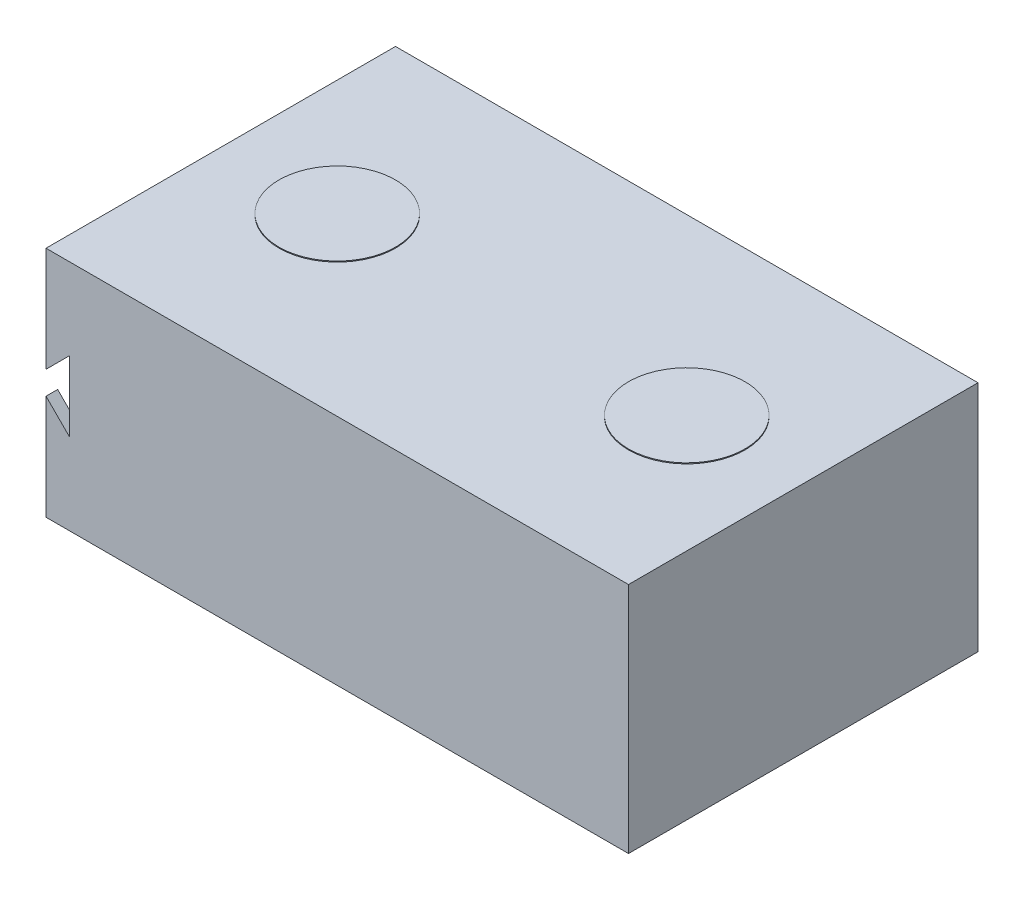
ISO-10303-21;
HEADER;
FILE_DESCRIPTION(('STEP AP214'),'2;1');
FILE_NAME('part.step','',(''),(''),'','','');
FILE_SCHEMA(('AUTOMOTIVE_DESIGN { 1 0 10303 214 1 1 1 1 }'));
ENDSEC;
DATA;
#1=APPLICATION_CONTEXT('core data for automotive mechanical design processes');
#2=APPLICATION_PROTOCOL_DEFINITION('international standard','automotive_design',2000,#1);
#3=PRODUCT_CONTEXT('',#1,'mechanical');
#4=PRODUCT('Part','Part','',(#3));
#5=PRODUCT_RELATED_PRODUCT_CATEGORY('part','',(#4));
#6=PRODUCT_DEFINITION_FORMATION('','',#4);
#7=PRODUCT_DEFINITION_CONTEXT('part definition',#1,'design');
#8=PRODUCT_DEFINITION('design','',#6,#7);
#9=PRODUCT_DEFINITION_SHAPE('','',#8);
#10=(LENGTH_UNIT() NAMED_UNIT(*) SI_UNIT(.MILLI.,.METRE.));
#11=(NAMED_UNIT(*) PLANE_ANGLE_UNIT() SI_UNIT($,.RADIAN.));
#12=(NAMED_UNIT(*) SI_UNIT($,.STERADIAN.) SOLID_ANGLE_UNIT());
#13=UNCERTAINTY_MEASURE_WITH_UNIT(LENGTH_MEASURE(1.E-05),#10,'distance_accuracy_value','');
#14=(GEOMETRIC_REPRESENTATION_CONTEXT(3) GLOBAL_UNCERTAINTY_ASSIGNED_CONTEXT((#13)) GLOBAL_UNIT_ASSIGNED_CONTEXT((#10,
#11,#12)) REPRESENTATION_CONTEXT('',''));
#15=CARTESIAN_POINT('',(0.,0.,0.));
#16=DIRECTION('',(0.,0.,1.));
#17=DIRECTION('',(1.,0.,0.));
#18=AXIS2_PLACEMENT_3D('',#15,#16,#17);
#19=CARTESIAN_POINT('',(-123.579545454545,100.,-64.157196969697));
#20=DIRECTION('',(1.,0.,0.));
#21=DIRECTION('',(0.,0.,-1.));
#22=AXIS2_PLACEMENT_3D('',#19,#20,#21);
#23=PLANE('',#22);
#24=DIRECTION('',(0.,-1.,0.));
#25=VECTOR('',#24,1.);
#26=CARTESIAN_POINT('',(-123.579545454545,95.,-59.157196969697));
#27=LINE('',#26,#25);
#28=CARTESIAN_POINT('',(-123.579545454545,45.,-59.157196969697));
#29=VERTEX_POINT('',#28);
#30=CARTESIAN_POINT('',(-123.579545454545,0.,-59.157196969697));
#31=VERTEX_POINT('',#30);
#32=EDGE_CURVE('E54',#29,#31,#27,.T.);
#33=ORIENTED_EDGE('',*,*,#32,.F.);
#34=DIRECTION('',(0.,0.,-1.));
#35=VECTOR('',#34,1.);
#36=CARTESIAN_POINT('',(-123.579545454545,45.,-59.157196969697));
#37=LINE('',#36,#35);
#38=CARTESIAN_POINT('',(-123.579545454545,45.,-64.157196969697));
#39=VERTEX_POINT('',#38);
#40=EDGE_CURVE('E196',#29,#39,#37,.T.);
#41=ORIENTED_EDGE('',*,*,#40,.T.);
#42=DIRECTION('',(0.,-1.,0.));
#43=VECTOR('',#42,1.);
#44=CARTESIAN_POINT('',(-123.579545454545,100.,-64.157196969697));
#45=LINE('',#44,#43);
#46=CARTESIAN_POINT('',(-123.579545454545,0.,-64.157196969697));
#47=VERTEX_POINT('',#46);
#48=EDGE_CURVE('E85',#39,#47,#45,.T.);
#49=ORIENTED_EDGE('',*,*,#48,.T.);
#50=DIRECTION('',(0.,0.,1.));
#51=VECTOR('',#50,1.);
#52=CARTESIAN_POINT('',(-123.579545454545,0.,-64.157196969697));
#53=LINE('',#52,#51);
#54=EDGE_CURVE('E274',#47,#31,#53,.T.);
#55=ORIENTED_EDGE('',*,*,#54,.T.);
#56=EDGE_LOOP('',(#33,#41,#49,#55));
#57=FACE_BOUND('',#56,.T.);
#58=ADVANCED_FACE('F39',(#57),#23,.F.);
#59=CARTESIAN_POINT('',(-123.579545454545,100.,-64.157196969697));
#60=VERTEX_POINT('',#59);
#61=CARTESIAN_POINT('',(-123.579545454545,55.,-64.157196969697));
#62=VERTEX_POINT('',#61);
#63=EDGE_CURVE('E281',#60,#62,#45,.T.);
#64=ORIENTED_EDGE('',*,*,#63,.T.);
#65=DIRECTION('',(0.,0.,-1.));
#66=VECTOR('',#65,1.);
#67=CARTESIAN_POINT('',(-123.579545454545,55.,-59.157196969697));
#68=LINE('',#67,#66);
#69=CARTESIAN_POINT('',(-123.579545454545,55.,-59.157196969697));
#70=VERTEX_POINT('',#69);
#71=EDGE_CURVE('E173',#70,#62,#68,.T.);
#72=ORIENTED_EDGE('',*,*,#71,.F.);
#73=CARTESIAN_POINT('',(-123.579545454545,95.,-59.157196969697));
#74=VERTEX_POINT('',#73);
#75=EDGE_CURVE('E186',#74,#70,#27,.T.);
#76=ORIENTED_EDGE('',*,*,#75,.F.);
#77=DIRECTION('',(0.,0.,-1.));
#78=VECTOR('',#77,1.);
#79=CARTESIAN_POINT('',(-123.579545454545,95.,80.842803030303));
#80=LINE('',#79,#78);
#81=CARTESIAN_POINT('',(-123.579545454545,95.,80.842803030303));
#82=VERTEX_POINT('',#81);
#83=EDGE_CURVE('E226',#82,#74,#80,.T.);
#84=ORIENTED_EDGE('',*,*,#83,.F.);
#85=DIRECTION('',(0.,-1.,0.));
#86=VECTOR('',#85,1.);
#87=CARTESIAN_POINT('',(-123.579545454545,95.,80.842803030303));
#88=LINE('',#87,#86);
#89=CARTESIAN_POINT('',(-123.579545454545,55.,80.842803030303));
#90=VERTEX_POINT('',#89);
#91=EDGE_CURVE('E245',#82,#90,#88,.T.);
#92=ORIENTED_EDGE('',*,*,#91,.T.);
#93=DIRECTION('',(0.,0.,1.));
#94=VECTOR('',#93,1.);
#95=CARTESIAN_POINT('',(-123.579545454545,55.,80.842803030303));
#96=LINE('',#95,#94);
#97=CARTESIAN_POINT('',(-123.579545454545,55.,85.842803030303));
#98=VERTEX_POINT('',#97);
#99=EDGE_CURVE('E221',#90,#98,#96,.T.);
#100=ORIENTED_EDGE('',*,*,#99,.T.);
#101=DIRECTION('',(0.,-1.,0.));
#102=VECTOR('',#101,1.);
#103=CARTESIAN_POINT('',(-123.579545454545,100.,85.842803030303));
#104=LINE('',#103,#102);
#105=CARTESIAN_POINT('',(-123.579545454545,100.,85.842803030303));
#106=VERTEX_POINT('',#105);
#107=EDGE_CURVE('E11',#106,#98,#104,.T.);
#108=ORIENTED_EDGE('',*,*,#107,.F.);
#109=DIRECTION('',(0.,0.,1.));
#110=VECTOR('',#109,1.);
#111=CARTESIAN_POINT('',(-123.579545454545,100.,-64.157196969697));
#112=LINE('',#111,#110);
#113=EDGE_CURVE('E267',#60,#106,#112,.T.);
#114=ORIENTED_EDGE('',*,*,#113,.F.);
#115=EDGE_LOOP('',(#64,#72,#76,#84,#92,#100,#108,#114));
#116=FACE_BOUND('',#115,.T.);
#117=ADVANCED_FACE('F312',(#116),#23,.F.);
#118=CARTESIAN_POINT('',(-123.579545454545,45.,85.842803030303));
#119=VERTEX_POINT('',#118);
#120=CARTESIAN_POINT('',(-123.579545454545,0.,85.842803030303));
#121=VERTEX_POINT('',#120);
#122=EDGE_CURVE('E47',#119,#121,#104,.T.);
#123=ORIENTED_EDGE('',*,*,#122,.F.);
#124=DIRECTION('',(0.,0.,1.));
#125=VECTOR('',#124,1.);
#126=CARTESIAN_POINT('',(-123.579545454545,45.,80.842803030303));
#127=LINE('',#126,#125);
#128=CARTESIAN_POINT('',(-123.579545454545,45.,80.842803030303));
#129=VERTEX_POINT('',#128);
#130=EDGE_CURVE('E219',#129,#119,#127,.T.);
#131=ORIENTED_EDGE('',*,*,#130,.F.);
#132=CARTESIAN_POINT('',(-123.579545454545,0.,80.842803030303));
#133=VERTEX_POINT('',#132);
#134=EDGE_CURVE('E249',#129,#133,#88,.T.);
#135=ORIENTED_EDGE('',*,*,#134,.T.);
#136=EDGE_CURVE('E258',#133,#121,#53,.T.);
#137=ORIENTED_EDGE('',*,*,#136,.T.);
#138=EDGE_LOOP('',(#123,#131,#135,#137));
#139=FACE_BOUND('',#138,.T.);
#140=ADVANCED_FACE('F41',(#139),#23,.F.);
#141=CARTESIAN_POINT('',(-123.579545454545,100.,85.842803030303));
#142=DIRECTION('',(0.,0.,-1.));
#143=DIRECTION('',(-1.,0.,0.));
#144=AXIS2_PLACEMENT_3D('',#141,#142,#143);
#145=PLANE('',#144);
#146=ORIENTED_EDGE('',*,*,#107,.T.);
#147=DIRECTION('',(-0.707106781186551,-0.707106781186544,0.));
#148=VECTOR('',#147,1.);
#149=CARTESIAN_POINT('',(-123.579545454545,55.,85.842803030303));
#150=LINE('',#149,#148);
#151=CARTESIAN_POINT('',(-113.579545454545,64.9999999999999,85.842803030303));
#152=VERTEX_POINT('',#151);
#153=EDGE_CURVE('E204',#152,#98,#150,.T.);
#154=ORIENTED_EDGE('',*,*,#153,.F.);
#155=DIRECTION('',(0.,1.,0.));
#156=VECTOR('',#155,1.);
#157=CARTESIAN_POINT('',(-113.579545454545,55.,85.842803030303));
#158=LINE('',#157,#156);
#159=CARTESIAN_POINT('',(-113.579545454545,35.0000000000001,85.842803030303));
#160=VERTEX_POINT('',#159);
#161=EDGE_CURVE('E209',#160,#152,#158,.T.);
#162=ORIENTED_EDGE('',*,*,#161,.F.);
#163=DIRECTION('',(0.707106781186551,-0.707106781186544,0.));
#164=VECTOR('',#163,1.);
#165=CARTESIAN_POINT('',(-113.579545454545,35.0000000000001,85.842803030303));
#166=LINE('',#165,#164);
#167=EDGE_CURVE('E206',#119,#160,#166,.T.);
#168=ORIENTED_EDGE('',*,*,#167,.F.);
#169=ORIENTED_EDGE('',*,*,#122,.T.);
#170=DIRECTION('',(1.,0.,0.));
#171=VECTOR('',#170,1.);
#172=CARTESIAN_POINT('',(-123.579545454545,0.,85.842803030303));
#173=LINE('',#172,#171);
#174=CARTESIAN_POINT('',(126.420454545455,0.,85.842803030303));
#175=VERTEX_POINT('',#174);
#176=EDGE_CURVE('E276',#121,#175,#173,.T.);
#177=ORIENTED_EDGE('',*,*,#176,.T.);
#178=DIRECTION('',(0.,-1.,0.));
#179=VECTOR('',#178,1.);
#180=CARTESIAN_POINT('',(126.420454545455,100.,85.842803030303));
#181=LINE('',#180,#179);
#182=CARTESIAN_POINT('',(126.420454545455,100.,85.842803030303));
#183=VERTEX_POINT('',#182);
#184=EDGE_CURVE('E286',#183,#175,#181,.T.);
#185=ORIENTED_EDGE('',*,*,#184,.F.);
#186=DIRECTION('',(1.,0.,0.));
#187=VECTOR('',#186,1.);
#188=CARTESIAN_POINT('',(-123.579545454545,100.,85.842803030303));
#189=LINE('',#188,#187);
#190=EDGE_CURVE('E92',#106,#183,#189,.T.);
#191=ORIENTED_EDGE('',*,*,#190,.F.);
#192=EDGE_LOOP('',(#146,#154,#162,#168,#169,#177,#185,#191));
#193=FACE_BOUND('',#192,.T.);
#194=ADVANCED_FACE('F294',(#193),#145,.F.);
#195=CARTESIAN_POINT('',(126.420454545455,100.,-64.157196969697));
#196=DIRECTION('',(-1.,0.,0.));
#197=DIRECTION('',(0.,0.,1.));
#198=AXIS2_PLACEMENT_3D('',#195,#196,#197);
#199=PLANE('',#198);
#200=DIRECTION('',(0.,0.,-1.));
#201=VECTOR('',#200,1.);
#202=CARTESIAN_POINT('',(126.420454545455,0.,-64.157196969697));
#203=LINE('',#202,#201);
#204=CARTESIAN_POINT('',(126.420454545455,0.,-64.157196969697));
#205=VERTEX_POINT('',#204);
#206=EDGE_CURVE('E278',#175,#205,#203,.T.);
#207=ORIENTED_EDGE('',*,*,#206,.T.);
#208=DIRECTION('',(0.,-1.,0.));
#209=VECTOR('',#208,1.);
#210=CARTESIAN_POINT('',(126.420454545455,100.,-64.157196969697));
#211=LINE('',#210,#209);
#212=CARTESIAN_POINT('',(126.420454545455,100.,-64.157196969697));
#213=VERTEX_POINT('',#212);
#214=EDGE_CURVE('E284',#213,#205,#211,.T.);
#215=ORIENTED_EDGE('',*,*,#214,.F.);
#216=DIRECTION('',(0.,0.,-1.));
#217=VECTOR('',#216,1.);
#218=CARTESIAN_POINT('',(126.420454545455,100.,-64.157196969697));
#219=LINE('',#218,#217);
#220=EDGE_CURVE('E271',#183,#213,#219,.T.);
#221=ORIENTED_EDGE('',*,*,#220,.F.);
#222=ORIENTED_EDGE('',*,*,#184,.T.);
#223=EDGE_LOOP('',(#207,#215,#221,#222));
#224=FACE_BOUND('',#223,.T.);
#225=ADVANCED_FACE('F306',(#224),#199,.F.);
#226=CARTESIAN_POINT('',(-123.579545454545,100.,-64.157196969697));
#227=DIRECTION('',(0.,0.,1.));
#228=DIRECTION('',(1.,0.,0.));
#229=AXIS2_PLACEMENT_3D('',#226,#227,#228);
#230=PLANE('',#229);
#231=DIRECTION('',(0.,-1.,0.));
#232=VECTOR('',#231,1.);
#233=CARTESIAN_POINT('',(-113.579545454545,55.,-64.157196969697));
#234=LINE('',#233,#232);
#235=CARTESIAN_POINT('',(-113.579545454545,64.9999999999999,-64.157196969697));
#236=VERTEX_POINT('',#235);
#237=CARTESIAN_POINT('',(-113.579545454545,35.0000000000001,-64.157196969697));
#238=VERTEX_POINT('',#237);
#239=EDGE_CURVE('E174',#236,#238,#234,.T.);
#240=ORIENTED_EDGE('',*,*,#239,.F.);
#241=DIRECTION('',(0.707106781186551,0.707106781186544,0.));
#242=VECTOR('',#241,1.);
#243=CARTESIAN_POINT('',(-123.579545454545,55.,-64.157196969697));
#244=LINE('',#243,#242);
#245=EDGE_CURVE('E181',#62,#236,#244,.T.);
#246=ORIENTED_EDGE('',*,*,#245,.F.);
#247=ORIENTED_EDGE('',*,*,#63,.F.);
#248=DIRECTION('',(-1.,0.,0.));
#249=VECTOR('',#248,1.);
#250=CARTESIAN_POINT('',(-123.579545454545,100.,-64.157196969697));
#251=LINE('',#250,#249);
#252=EDGE_CURVE('E63',#213,#60,#251,.T.);
#253=ORIENTED_EDGE('',*,*,#252,.F.);
#254=ORIENTED_EDGE('',*,*,#214,.T.);
#255=DIRECTION('',(-1.,0.,0.));
#256=VECTOR('',#255,1.);
#257=CARTESIAN_POINT('',(-123.579545454545,0.,-64.157196969697));
#258=LINE('',#257,#256);
#259=EDGE_CURVE('E269',#205,#47,#258,.T.);
#260=ORIENTED_EDGE('',*,*,#259,.T.);
#261=ORIENTED_EDGE('',*,*,#48,.F.);
#262=DIRECTION('',(-0.707106781186551,0.707106781186544,0.));
#263=VECTOR('',#262,1.);
#264=CARTESIAN_POINT('',(-123.579545454545,45.,-64.157196969697));
#265=LINE('',#264,#263);
#266=EDGE_CURVE('E188',#238,#39,#265,.T.);
#267=ORIENTED_EDGE('',*,*,#266,.F.);
#268=EDGE_LOOP('',(#240,#246,#247,#253,#254,#260,#261,#267));
#269=FACE_BOUND('',#268,.T.);
#270=ADVANCED_FACE('F308',(#269),#230,.F.);
#271=CARTESIAN_POINT('',(0.,100.,0.));
#272=DIRECTION('',(0.,1.,0.));
#273=DIRECTION('',(0.,0.,1.));
#274=AXIS2_PLACEMENT_3D('',#271,#272,#273);
#275=PLANE('',#274);
#276=CARTESIAN_POINT('',(76.4204545454545,100.,10.842803030303));
#277=DIRECTION('',(0.,1.,0.));
#278=DIRECTION('',(0.,0.,1.));
#279=AXIS2_PLACEMENT_3D('',#276,#277,#278);
#280=CIRCLE('',#279,25.);
#281=CARTESIAN_POINT('',(76.4204545454545,100.,35.842803030303));
#282=VERTEX_POINT('',#281);
#283=EDGE_CURVE('E259',#282,#282,#280,.T.);
#284=ORIENTED_EDGE('',*,*,#283,.F.);
#285=EDGE_LOOP('',(#284));
#286=FACE_BOUND('',#285,.T.);
#287=CARTESIAN_POINT('',(-73.5795454545455,100.,10.842803030303));
#288=DIRECTION('',(0.,1.,0.));
#289=DIRECTION('',(0.,0.,1.));
#290=AXIS2_PLACEMENT_3D('',#287,#288,#289);
#291=CIRCLE('',#290,25.);
#292=CARTESIAN_POINT('',(-73.5795454545455,100.,35.842803030303));
#293=VERTEX_POINT('',#292);
#294=EDGE_CURVE('E262',#293,#293,#291,.T.);
#295=ORIENTED_EDGE('',*,*,#294,.F.);
#296=EDGE_LOOP('',(#295));
#297=FACE_BOUND('',#296,.T.);
#298=ORIENTED_EDGE('',*,*,#113,.T.);
#299=ORIENTED_EDGE('',*,*,#190,.T.);
#300=ORIENTED_EDGE('',*,*,#220,.T.);
#301=ORIENTED_EDGE('',*,*,#252,.T.);
#302=EDGE_LOOP('',(#298,#299,#300,#301));
#303=FACE_BOUND('',#302,.T.);
#304=ADVANCED_FACE('F313',(#286,#297,#303),#275,.T.);
#305=CARTESIAN_POINT('',(0.,0.,0.));
#306=DIRECTION('',(0.,1.,0.));
#307=DIRECTION('',(0.,0.,1.));
#308=AXIS2_PLACEMENT_3D('',#305,#306,#307);
#309=PLANE('',#308);
#310=ORIENTED_EDGE('',*,*,#136,.F.);
#311=DIRECTION('',(-1.,0.,0.));
#312=VECTOR('',#311,1.);
#313=CARTESIAN_POINT('',(-123.579545454545,0.,80.842803030303));
#314=LINE('',#313,#312);
#315=CARTESIAN_POINT('',(121.420454545455,0.,80.842803030303));
#316=VERTEX_POINT('',#315);
#317=EDGE_CURVE('E230',#316,#133,#314,.T.);
#318=ORIENTED_EDGE('',*,*,#317,.F.);
#319=DIRECTION('',(0.,0.,1.));
#320=VECTOR('',#319,1.);
#321=CARTESIAN_POINT('',(121.420454545455,0.,80.842803030303));
#322=LINE('',#321,#320);
#323=CARTESIAN_POINT('',(121.420454545455,0.,-59.157196969697));
#324=VERTEX_POINT('',#323);
#325=EDGE_CURVE('E240',#324,#316,#322,.T.);
#326=ORIENTED_EDGE('',*,*,#325,.F.);
#327=DIRECTION('',(1.,0.,0.));
#328=VECTOR('',#327,1.);
#329=CARTESIAN_POINT('',(-123.579545454545,0.,-59.157196969697));
#330=LINE('',#329,#328);
#331=EDGE_CURVE('E224',#31,#324,#330,.T.);
#332=ORIENTED_EDGE('',*,*,#331,.F.);
#333=ORIENTED_EDGE('',*,*,#54,.F.);
#334=ORIENTED_EDGE('',*,*,#259,.F.);
#335=ORIENTED_EDGE('',*,*,#206,.F.);
#336=ORIENTED_EDGE('',*,*,#176,.F.);
#337=EDGE_LOOP('',(#310,#318,#326,#332,#333,#334,#335,#336));
#338=FACE_BOUND('',#337,.T.);
#339=ADVANCED_FACE('F302',(#338),#309,.F.);
#340=CARTESIAN_POINT('',(-73.5795454545455,100.4,10.842803030303));
#341=DIRECTION('',(0.,-1.,0.));
#342=DIRECTION('',(0.,0.,-1.));
#343=AXIS2_PLACEMENT_3D('',#340,#341,#342);
#344=CYLINDRICAL_SURFACE('',#343,25.);
#345=CARTESIAN_POINT('',(-73.5795454545455,100.4,10.842803030303));
#346=DIRECTION('',(0.,1.,0.));
#347=DIRECTION('',(0.,0.,1.));
#348=AXIS2_PLACEMENT_3D('',#345,#346,#347);
#349=CIRCLE('',#348,25.);
#350=CARTESIAN_POINT('',(-73.5795454545455,100.4,35.842803030303));
#351=VERTEX_POINT('',#350);
#352=EDGE_CURVE('E248',#351,#351,#349,.T.);
#353=ORIENTED_EDGE('',*,*,#352,.F.);
#354=EDGE_LOOP('',(#353));
#355=FACE_BOUND('',#354,.T.);
#356=ORIENTED_EDGE('',*,*,#294,.T.);
#357=EDGE_LOOP('',(#356));
#358=FACE_BOUND('',#357,.T.);
#359=ADVANCED_FACE('F322',(#355,#358),#344,.T.);
#360=CARTESIAN_POINT('',(-73.5795454545455,100.4,10.842803030303));
#361=DIRECTION('',(0.,1.,0.));
#362=DIRECTION('',(0.,0.,1.));
#363=AXIS2_PLACEMENT_3D('',#360,#361,#362);
#364=PLANE('',#363);
#365=ORIENTED_EDGE('',*,*,#352,.T.);
#366=EDGE_LOOP('',(#365));
#367=FACE_BOUND('',#366,.T.);
#368=ADVANCED_FACE('F376',(#367),#364,.T.);
#369=CARTESIAN_POINT('',(76.4204545454545,100.4,10.842803030303));
#370=DIRECTION('',(0.,-1.,0.));
#371=DIRECTION('',(0.,0.,-1.));
#372=AXIS2_PLACEMENT_3D('',#369,#370,#371);
#373=CYLINDRICAL_SURFACE('',#372,25.);
#374=CARTESIAN_POINT('',(76.4204545454545,100.4,10.842803030303));
#375=DIRECTION('',(0.,1.,0.));
#376=DIRECTION('',(0.,0.,1.));
#377=AXIS2_PLACEMENT_3D('',#374,#375,#376);
#378=CIRCLE('',#377,25.);
#379=CARTESIAN_POINT('',(76.4204545454545,100.4,35.842803030303));
#380=VERTEX_POINT('',#379);
#381=EDGE_CURVE('E255',#380,#380,#378,.T.);
#382=ORIENTED_EDGE('',*,*,#381,.F.);
#383=EDGE_LOOP('',(#382));
#384=FACE_BOUND('',#383,.T.);
#385=ORIENTED_EDGE('',*,*,#283,.T.);
#386=EDGE_LOOP('',(#385));
#387=FACE_BOUND('',#386,.T.);
#388=ADVANCED_FACE('F386',(#384,#387),#373,.T.);
#389=CARTESIAN_POINT('',(76.4204545454545,100.4,10.842803030303));
#390=DIRECTION('',(0.,1.,0.));
#391=DIRECTION('',(0.,0.,1.));
#392=AXIS2_PLACEMENT_3D('',#389,#390,#391);
#393=PLANE('',#392);
#394=ORIENTED_EDGE('',*,*,#381,.T.);
#395=EDGE_LOOP('',(#394));
#396=FACE_BOUND('',#395,.T.);
#397=ADVANCED_FACE('F395',(#396),#393,.T.);
#398=CARTESIAN_POINT('',(-123.579545454545,95.,80.842803030303));
#399=DIRECTION('',(0.,0.,1.));
#400=DIRECTION('',(1.,0.,0.));
#401=AXIS2_PLACEMENT_3D('',#398,#399,#400);
#402=PLANE('',#401);
#403=DIRECTION('',(0.,1.,0.));
#404=VECTOR('',#403,1.);
#405=CARTESIAN_POINT('',(-113.579545454545,55.,80.842803030303));
#406=LINE('',#405,#404);
#407=CARTESIAN_POINT('',(-113.579545454545,35.0000000000001,80.842803030303));
#408=VERTEX_POINT('',#407);
#409=CARTESIAN_POINT('',(-113.579545454545,64.9999999999999,80.842803030303));
#410=VERTEX_POINT('',#409);
#411=EDGE_CURVE('E217',#408,#410,#406,.T.);
#412=ORIENTED_EDGE('',*,*,#411,.T.);
#413=DIRECTION('',(-0.707106781186551,-0.707106781186544,0.));
#414=VECTOR('',#413,1.);
#415=CARTESIAN_POINT('',(-123.579545454545,55.,80.842803030303));
#416=LINE('',#415,#414);
#417=EDGE_CURVE('E200',#410,#90,#416,.T.);
#418=ORIENTED_EDGE('',*,*,#417,.T.);
#419=ORIENTED_EDGE('',*,*,#91,.F.);
#420=DIRECTION('',(-1.,0.,0.));
#421=VECTOR('',#420,1.);
#422=CARTESIAN_POINT('',(-123.579545454545,95.,80.842803030303));
#423=LINE('',#422,#421);
#424=CARTESIAN_POINT('',(121.420454545455,95.,80.842803030303));
#425=VERTEX_POINT('',#424);
#426=EDGE_CURVE('E236',#425,#82,#423,.T.);
#427=ORIENTED_EDGE('',*,*,#426,.F.);
#428=DIRECTION('',(0.,-1.,0.));
#429=VECTOR('',#428,1.);
#430=CARTESIAN_POINT('',(121.420454545455,95.,80.842803030303));
#431=LINE('',#430,#429);
#432=EDGE_CURVE('E250',#425,#316,#431,.T.);
#433=ORIENTED_EDGE('',*,*,#432,.T.);
#434=ORIENTED_EDGE('',*,*,#317,.T.);
#435=ORIENTED_EDGE('',*,*,#134,.F.);
#436=DIRECTION('',(0.707106781186551,-0.707106781186544,0.));
#437=VECTOR('',#436,1.);
#438=CARTESIAN_POINT('',(-113.579545454545,35.0000000000001,80.842803030303));
#439=LINE('',#438,#437);
#440=EDGE_CURVE('E212',#129,#408,#439,.T.);
#441=ORIENTED_EDGE('',*,*,#440,.T.);
#442=EDGE_LOOP('',(#412,#418,#419,#427,#433,#434,#435,#441));
#443=FACE_BOUND('',#442,.T.);
#444=ADVANCED_FACE('F404',(#443),#402,.F.);
#445=CARTESIAN_POINT('',(121.420454545455,95.,80.842803030303));
#446=DIRECTION('',(1.,0.,0.));
#447=DIRECTION('',(0.,0.,-1.));
#448=AXIS2_PLACEMENT_3D('',#445,#446,#447);
#449=PLANE('',#448);
#450=ORIENTED_EDGE('',*,*,#325,.T.);
#451=ORIENTED_EDGE('',*,*,#432,.F.);
#452=DIRECTION('',(0.,0.,1.));
#453=VECTOR('',#452,1.);
#454=CARTESIAN_POINT('',(121.420454545455,95.,80.842803030303));
#455=LINE('',#454,#453);
#456=CARTESIAN_POINT('',(121.420454545455,95.,-59.157196969697));
#457=VERTEX_POINT('',#456);
#458=EDGE_CURVE('E233',#457,#425,#455,.T.);
#459=ORIENTED_EDGE('',*,*,#458,.F.);
#460=DIRECTION('',(0.,-1.,0.));
#461=VECTOR('',#460,1.);
#462=CARTESIAN_POINT('',(121.420454545455,95.,-59.157196969697));
#463=LINE('',#462,#461);
#464=EDGE_CURVE('E252',#457,#324,#463,.T.);
#465=ORIENTED_EDGE('',*,*,#464,.T.);
#466=EDGE_LOOP('',(#450,#451,#459,#465));
#467=FACE_BOUND('',#466,.T.);
#468=ADVANCED_FACE('F413',(#467),#449,.F.);
#469=CARTESIAN_POINT('',(-123.579545454545,95.,-59.157196969697));
#470=DIRECTION('',(0.,0.,-1.));
#471=DIRECTION('',(-1.,0.,0.));
#472=AXIS2_PLACEMENT_3D('',#469,#470,#471);
#473=PLANE('',#472);
#474=DIRECTION('',(0.707106781186551,0.707106781186544,0.));
#475=VECTOR('',#474,1.);
#476=CARTESIAN_POINT('',(-123.579545454545,55.,-59.157196969697));
#477=LINE('',#476,#475);
#478=CARTESIAN_POINT('',(-113.579545454545,64.9999999999999,-59.157196969697));
#479=VERTEX_POINT('',#478);
#480=EDGE_CURVE('E178',#70,#479,#477,.T.);
#481=ORIENTED_EDGE('',*,*,#480,.T.);
#482=DIRECTION('',(0.,-1.,0.));
#483=VECTOR('',#482,1.);
#484=CARTESIAN_POINT('',(-113.579545454545,55.,-59.157196969697));
#485=LINE('',#484,#483);
#486=CARTESIAN_POINT('',(-113.579545454545,35.0000000000001,-59.157196969697));
#487=VERTEX_POINT('',#486);
#488=EDGE_CURVE('E164',#479,#487,#485,.T.);
#489=ORIENTED_EDGE('',*,*,#488,.T.);
#490=DIRECTION('',(-0.707106781186551,0.707106781186544,0.));
#491=VECTOR('',#490,1.);
#492=CARTESIAN_POINT('',(-123.579545454545,45.,-59.157196969697));
#493=LINE('',#492,#491);
#494=EDGE_CURVE('E192',#487,#29,#493,.T.);
#495=ORIENTED_EDGE('',*,*,#494,.T.);
#496=ORIENTED_EDGE('',*,*,#32,.T.);
#497=ORIENTED_EDGE('',*,*,#331,.T.);
#498=ORIENTED_EDGE('',*,*,#464,.F.);
#499=DIRECTION('',(1.,0.,0.));
#500=VECTOR('',#499,1.);
#501=CARTESIAN_POINT('',(-123.579545454545,95.,-59.157196969697));
#502=LINE('',#501,#500);
#503=EDGE_CURVE('E229',#74,#457,#502,.T.);
#504=ORIENTED_EDGE('',*,*,#503,.F.);
#505=ORIENTED_EDGE('',*,*,#75,.T.);
#506=EDGE_LOOP('',(#481,#489,#495,#496,#497,#498,#504,#505));
#507=FACE_BOUND('',#506,.T.);
#508=ADVANCED_FACE('F184',(#507),#473,.F.);
#509=CARTESIAN_POINT('',(0.,95.,0.));
#510=DIRECTION('',(0.,-1.,0.));
#511=DIRECTION('',(0.,0.,-1.));
#512=AXIS2_PLACEMENT_3D('',#509,#510,#511);
#513=PLANE('',#512);
#514=ORIENTED_EDGE('',*,*,#83,.T.);
#515=ORIENTED_EDGE('',*,*,#503,.T.);
#516=ORIENTED_EDGE('',*,*,#458,.T.);
#517=ORIENTED_EDGE('',*,*,#426,.T.);
#518=EDGE_LOOP('',(#514,#515,#516,#517));
#519=FACE_BOUND('',#518,.T.);
#520=ADVANCED_FACE('F431',(#519),#513,.T.);
#521=CARTESIAN_POINT('',(-113.579545454545,55.,80.842803030303));
#522=DIRECTION('',(1.,0.,0.));
#523=DIRECTION('',(0.,0.,-1.));
#524=AXIS2_PLACEMENT_3D('',#521,#522,#523);
#525=PLANE('',#524);
#526=ORIENTED_EDGE('',*,*,#161,.T.);
#527=DIRECTION('',(0.,0.,1.));
#528=VECTOR('',#527,1.);
#529=CARTESIAN_POINT('',(-113.579545454545,64.9999999999999,80.842803030303));
#530=LINE('',#529,#528);
#531=EDGE_CURVE('E203',#410,#152,#530,.T.);
#532=ORIENTED_EDGE('',*,*,#531,.F.);
#533=ORIENTED_EDGE('',*,*,#411,.F.);
#534=DIRECTION('',(0.,0.,1.));
#535=VECTOR('',#534,1.);
#536=CARTESIAN_POINT('',(-113.579545454545,35.0000000000001,80.842803030303));
#537=LINE('',#536,#535);
#538=EDGE_CURVE('E198',#408,#160,#537,.T.);
#539=ORIENTED_EDGE('',*,*,#538,.T.);
#540=EDGE_LOOP('',(#526,#532,#533,#539));
#541=FACE_BOUND('',#540,.T.);
#542=ADVANCED_FACE('F440',(#541),#525,.F.);
#543=CARTESIAN_POINT('',(-113.579545454545,35.0000000000001,80.842803030303));
#544=DIRECTION('',(-0.707106781186544,-0.707106781186551,0.));
#545=DIRECTION('',(0.707106781186551,-0.707106781186544,0.));
#546=AXIS2_PLACEMENT_3D('',#543,#544,#545);
#547=PLANE('',#546);
#548=ORIENTED_EDGE('',*,*,#167,.T.);
#549=ORIENTED_EDGE('',*,*,#538,.F.);
#550=ORIENTED_EDGE('',*,*,#440,.F.);
#551=ORIENTED_EDGE('',*,*,#130,.T.);
#552=EDGE_LOOP('',(#548,#549,#550,#551));
#553=FACE_BOUND('',#552,.T.);
#554=ADVANCED_FACE('F454',(#553),#547,.F.);
#555=CARTESIAN_POINT('',(-123.579545454545,55.,80.842803030303));
#556=DIRECTION('',(-0.707106781186544,0.707106781186551,0.));
#557=DIRECTION('',(-0.707106781186551,-0.707106781186544,0.));
#558=AXIS2_PLACEMENT_3D('',#555,#556,#557);
#559=PLANE('',#558);
#560=ORIENTED_EDGE('',*,*,#153,.T.);
#561=ORIENTED_EDGE('',*,*,#99,.F.);
#562=ORIENTED_EDGE('',*,*,#417,.F.);
#563=ORIENTED_EDGE('',*,*,#531,.T.);
#564=EDGE_LOOP('',(#560,#561,#562,#563));
#565=FACE_BOUND('',#564,.T.);
#566=ADVANCED_FACE('F470',(#565),#559,.F.);
#567=CARTESIAN_POINT('',(-113.579545454545,55.,-59.157196969697));
#568=DIRECTION('',(1.,0.,0.));
#569=DIRECTION('',(0.,0.,-1.));
#570=AXIS2_PLACEMENT_3D('',#567,#568,#569);
#571=PLANE('',#570);
#572=ORIENTED_EDGE('',*,*,#239,.T.);
#573=DIRECTION('',(0.,0.,-1.));
#574=VECTOR('',#573,1.);
#575=CARTESIAN_POINT('',(-113.579545454545,35.0000000000001,-59.157196969697));
#576=LINE('',#575,#574);
#577=EDGE_CURVE('E170',#487,#238,#576,.T.);
#578=ORIENTED_EDGE('',*,*,#577,.F.);
#579=ORIENTED_EDGE('',*,*,#488,.F.);
#580=DIRECTION('',(0.,0.,-1.));
#581=VECTOR('',#580,1.);
#582=CARTESIAN_POINT('',(-113.579545454545,64.9999999999999,-59.157196969697));
#583=LINE('',#582,#581);
#584=EDGE_CURVE('E167',#479,#236,#583,.T.);
#585=ORIENTED_EDGE('',*,*,#584,.T.);
#586=EDGE_LOOP('',(#572,#578,#579,#585));
#587=FACE_BOUND('',#586,.T.);
#588=ADVANCED_FACE('F166',(#587),#571,.F.);
#589=CARTESIAN_POINT('',(-123.579545454545,55.,-59.157196969697));
#590=DIRECTION('',(-0.707106781186544,0.707106781186551,0.));
#591=DIRECTION('',(-0.707106781186551,-0.707106781186544,0.));
#592=AXIS2_PLACEMENT_3D('',#589,#590,#591);
#593=PLANE('',#592);
#594=ORIENTED_EDGE('',*,*,#245,.T.);
#595=ORIENTED_EDGE('',*,*,#584,.F.);
#596=ORIENTED_EDGE('',*,*,#480,.F.);
#597=ORIENTED_EDGE('',*,*,#71,.T.);
#598=EDGE_LOOP('',(#594,#595,#596,#597));
#599=FACE_BOUND('',#598,.T.);
#600=ADVANCED_FACE('F177',(#599),#593,.F.);
#601=CARTESIAN_POINT('',(-123.579545454545,45.,-59.157196969697));
#602=DIRECTION('',(-0.707106781186544,-0.707106781186551,0.));
#603=DIRECTION('',(0.707106781186551,-0.707106781186544,0.));
#604=AXIS2_PLACEMENT_3D('',#601,#602,#603);
#605=PLANE('',#604);
#606=ORIENTED_EDGE('',*,*,#266,.T.);
#607=ORIENTED_EDGE('',*,*,#40,.F.);
#608=ORIENTED_EDGE('',*,*,#494,.F.);
#609=ORIENTED_EDGE('',*,*,#577,.T.);
#610=EDGE_LOOP('',(#606,#607,#608,#609));
#611=FACE_BOUND('',#610,.T.);
#612=ADVANCED_FACE('F505',(#611),#605,.F.);
#613=CLOSED_SHELL('',(#58,#117,#140,#194,#225,#270,#304,#339,#359,#368,#388,#397,#444,#468,#508,
#520,#542,#554,#566,#588,#600,#612));
#614=MANIFOLD_SOLID_BREP('B2',#613);
#615=ADVANCED_BREP_SHAPE_REPRESENTATION('',(#18,#614),#14);
#616=SHAPE_DEFINITION_REPRESENTATION(#9,#615);
ENDSEC;
END-ISO-10303-21;
